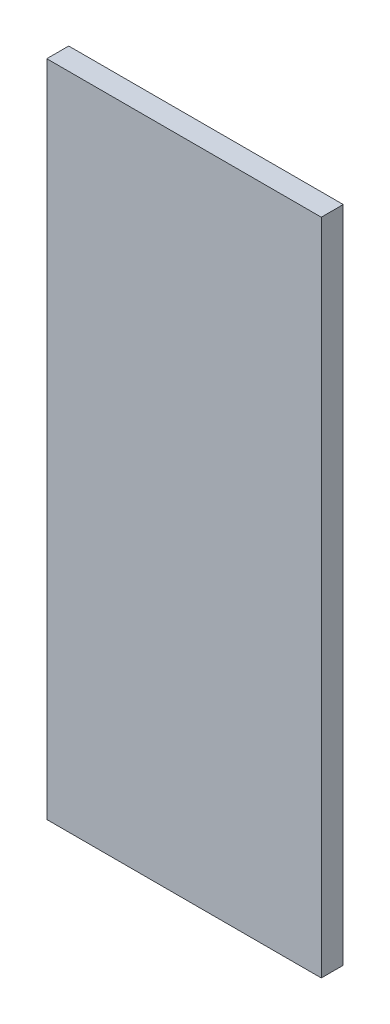
ISO-10303-21;
HEADER;
FILE_DESCRIPTION(('STEP AP214'),'2;1');
FILE_NAME('part.step','',(''),(''),'','','');
FILE_SCHEMA(('AUTOMOTIVE_DESIGN { 1 0 10303 214 1 1 1 1 }'));
ENDSEC;
DATA;
#1=APPLICATION_CONTEXT('core data for automotive mechanical design processes');
#2=APPLICATION_PROTOCOL_DEFINITION('international standard','automotive_design',2000,#1);
#3=PRODUCT_CONTEXT('',#1,'mechanical');
#4=PRODUCT('Part','Part','',(#3));
#5=PRODUCT_RELATED_PRODUCT_CATEGORY('part','',(#4));
#6=PRODUCT_DEFINITION_FORMATION('','',#4);
#7=PRODUCT_DEFINITION_CONTEXT('part definition',#1,'design');
#8=PRODUCT_DEFINITION('design','',#6,#7);
#9=PRODUCT_DEFINITION_SHAPE('','',#8);
#10=(LENGTH_UNIT() NAMED_UNIT(*) SI_UNIT(.MILLI.,.METRE.));
#11=(NAMED_UNIT(*) PLANE_ANGLE_UNIT() SI_UNIT($,.RADIAN.));
#12=(NAMED_UNIT(*) SI_UNIT($,.STERADIAN.) SOLID_ANGLE_UNIT());
#13=UNCERTAINTY_MEASURE_WITH_UNIT(LENGTH_MEASURE(1.E-05),#10,'distance_accuracy_value','');
#14=(GEOMETRIC_REPRESENTATION_CONTEXT(3) GLOBAL_UNCERTAINTY_ASSIGNED_CONTEXT((#13)) GLOBAL_UNIT_ASSIGNED_CONTEXT((#10,
#11,#12)) REPRESENTATION_CONTEXT('',''));
#15=CARTESIAN_POINT('',(0.,0.,0.));
#16=DIRECTION('',(0.,0.,1.));
#17=DIRECTION('',(1.,0.,0.));
#18=AXIS2_PLACEMENT_3D('',#15,#16,#17);
#19=CARTESIAN_POINT('',(-568.48934761149,-611.90552333629,-816.486147986318));
#20=DIRECTION('',(0.,0.,-1.));
#21=DIRECTION('',(-1.,0.,0.));
#22=AXIS2_PLACEMENT_3D('',#19,#20,#21);
#23=PLANE('',#22);
#24=DIRECTION('',(0.,1.,0.));
#25=VECTOR('',#24,1.);
#26=CARTESIAN_POINT('',(-628.489347611488,-611.90552333629,-816.486147986318));
#27=LINE('',#26,#25);
#28=CARTESIAN_POINT('',(-628.489347611488,-551.905523336291,-816.486147986318));
#29=VERTEX_POINT('',#28);
#30=CARTESIAN_POINT('',(-628.489347611488,-671.905523336291,-816.486147986318));
#31=VERTEX_POINT('',#30);
#32=EDGE_CURVE('E56',#29,#31,#27,.F.);
#33=ORIENTED_EDGE('',*,*,#32,.F.);
#34=DIRECTION('',(1.,0.,0.));
#35=VECTOR('',#34,1.);
#36=CARTESIAN_POINT('',(-568.48934761149,-551.905523336291,-816.486147986318));
#37=LINE('',#36,#35);
#38=CARTESIAN_POINT('',(-578.489347611488,-551.905523336291,-816.486147986318));
#39=VERTEX_POINT('',#38);
#40=EDGE_CURVE('E82',#39,#29,#37,.F.);
#41=ORIENTED_EDGE('',*,*,#40,.F.);
#42=DIRECTION('',(0.,1.,0.));
#43=VECTOR('',#42,1.);
#44=CARTESIAN_POINT('',(-578.489347611488,-611.90552333629,-816.486147986318));
#45=LINE('',#44,#43);
#46=CARTESIAN_POINT('',(-578.489347611488,-671.905523336291,-816.486147986318));
#47=VERTEX_POINT('',#46);
#48=EDGE_CURVE('E59',#47,#39,#45,.T.);
#49=ORIENTED_EDGE('',*,*,#48,.F.);
#50=DIRECTION('',(1.,0.,0.));
#51=VECTOR('',#50,1.);
#52=CARTESIAN_POINT('',(-568.48934761149,-671.905523336291,-816.486147986318));
#53=LINE('',#52,#51);
#54=EDGE_CURVE('E20',#31,#47,#53,.T.);
#55=ORIENTED_EDGE('',*,*,#54,.F.);
#56=EDGE_LOOP('',(#33,#41,#49,#55));
#57=FACE_BOUND('',#56,.T.);
#58=ADVANCED_FACE('F17',(#57),#23,.T.);
#59=CARTESIAN_POINT('',(-568.48934761149,-671.905523336291,-814.486147986318));
#60=DIRECTION('',(0.,-1.,0.));
#61=DIRECTION('',(0.,0.,-1.));
#62=AXIS2_PLACEMENT_3D('',#59,#60,#61);
#63=PLANE('',#62);
#64=DIRECTION('',(0.,0.,1.));
#65=VECTOR('',#64,1.);
#66=CARTESIAN_POINT('',(-628.489347611488,-671.905523336291,-814.486147986318));
#67=LINE('',#66,#65);
#68=CARTESIAN_POINT('',(-628.489347611488,-671.905523336291,-812.486147986318));
#69=VERTEX_POINT('',#68);
#70=EDGE_CURVE('E65',#31,#69,#67,.T.);
#71=ORIENTED_EDGE('',*,*,#70,.F.);
#72=ORIENTED_EDGE('',*,*,#54,.T.);
#73=DIRECTION('',(0.,0.,-1.));
#74=VECTOR('',#73,1.);
#75=CARTESIAN_POINT('',(-578.489347611488,-671.905523336291,-814.486147986318));
#76=LINE('',#75,#74);
#77=CARTESIAN_POINT('',(-578.489347611488,-671.905523336291,-812.486147986318));
#78=VERTEX_POINT('',#77);
#79=EDGE_CURVE('E87',#78,#47,#76,.T.);
#80=ORIENTED_EDGE('',*,*,#79,.F.);
#81=DIRECTION('',(-1.,0.,0.));
#82=VECTOR('',#81,1.);
#83=CARTESIAN_POINT('',(-568.48934761149,-671.905523336291,-812.486147986318));
#84=LINE('',#83,#82);
#85=EDGE_CURVE('E76',#78,#69,#84,.T.);
#86=ORIENTED_EDGE('',*,*,#85,.T.);
#87=EDGE_LOOP('',(#71,#72,#80,#86));
#88=FACE_BOUND('',#87,.T.);
#89=ADVANCED_FACE('F75',(#88),#63,.T.);
#90=CARTESIAN_POINT('',(-628.489347611488,-611.90552333629,-814.486147986318));
#91=DIRECTION('',(-1.,0.,0.));
#92=DIRECTION('',(0.,0.,1.));
#93=AXIS2_PLACEMENT_3D('',#90,#91,#92);
#94=PLANE('',#93);
#95=DIRECTION('',(0.,0.,1.));
#96=VECTOR('',#95,1.);
#97=CARTESIAN_POINT('',(-628.489347611488,-551.905523336291,-814.486147986318));
#98=LINE('',#97,#96);
#99=CARTESIAN_POINT('',(-628.489347611488,-551.905523336291,-812.486147986318));
#100=VERTEX_POINT('',#99);
#101=EDGE_CURVE('E71',#29,#100,#98,.T.);
#102=ORIENTED_EDGE('',*,*,#101,.F.);
#103=ORIENTED_EDGE('',*,*,#32,.T.);
#104=ORIENTED_EDGE('',*,*,#70,.T.);
#105=DIRECTION('',(0.,1.,0.));
#106=VECTOR('',#105,1.);
#107=CARTESIAN_POINT('',(-628.489347611488,-611.90552333629,-812.486147986318));
#108=LINE('',#107,#106);
#109=EDGE_CURVE('E94',#69,#100,#108,.T.);
#110=ORIENTED_EDGE('',*,*,#109,.T.);
#111=EDGE_LOOP('',(#102,#103,#104,#110));
#112=FACE_BOUND('',#111,.T.);
#113=ADVANCED_FACE('F68',(#112),#94,.T.);
#114=CARTESIAN_POINT('',(-568.48934761149,-551.905523336291,-814.486147986318));
#115=DIRECTION('',(0.,1.,0.));
#116=DIRECTION('',(0.,0.,1.));
#117=AXIS2_PLACEMENT_3D('',#114,#115,#116);
#118=PLANE('',#117);
#119=DIRECTION('',(0.,0.,-1.));
#120=VECTOR('',#119,1.);
#121=CARTESIAN_POINT('',(-578.489347611488,-551.905523336291,-814.486147986318));
#122=LINE('',#121,#120);
#123=CARTESIAN_POINT('',(-578.489347611488,-551.905523336291,-812.486147986318));
#124=VERTEX_POINT('',#123);
#125=EDGE_CURVE('E35',#39,#124,#122,.F.);
#126=ORIENTED_EDGE('',*,*,#125,.F.);
#127=ORIENTED_EDGE('',*,*,#40,.T.);
#128=ORIENTED_EDGE('',*,*,#101,.T.);
#129=DIRECTION('',(-1.,0.,0.));
#130=VECTOR('',#129,1.);
#131=CARTESIAN_POINT('',(-568.48934761149,-551.905523336291,-812.486147986318));
#132=LINE('',#131,#130);
#133=EDGE_CURVE('E27',#100,#124,#132,.F.);
#134=ORIENTED_EDGE('',*,*,#133,.T.);
#135=EDGE_LOOP('',(#126,#127,#128,#134));
#136=FACE_BOUND('',#135,.T.);
#137=ADVANCED_FACE('F101',(#136),#118,.T.);
#138=CARTESIAN_POINT('',(-578.489347611488,-611.90552333629,-814.486147986318));
#139=DIRECTION('',(1.,0.,0.));
#140=DIRECTION('',(0.,0.,-1.));
#141=AXIS2_PLACEMENT_3D('',#138,#139,#140);
#142=PLANE('',#141);
#143=ORIENTED_EDGE('',*,*,#79,.T.);
#144=ORIENTED_EDGE('',*,*,#48,.T.);
#145=ORIENTED_EDGE('',*,*,#125,.T.);
#146=DIRECTION('',(0.,1.,0.));
#147=VECTOR('',#146,1.);
#148=CARTESIAN_POINT('',(-578.489347611488,-611.90552333629,-812.486147986318));
#149=LINE('',#148,#147);
#150=EDGE_CURVE('E11',#124,#78,#149,.F.);
#151=ORIENTED_EDGE('',*,*,#150,.T.);
#152=EDGE_LOOP('',(#143,#144,#145,#151));
#153=FACE_BOUND('',#152,.T.);
#154=ADVANCED_FACE('F104',(#153),#142,.T.);
#155=CARTESIAN_POINT('',(-568.48934761149,-611.90552333629,-812.486147986318));
#156=DIRECTION('',(0.,0.,-1.));
#157=DIRECTION('',(-1.,0.,0.));
#158=AXIS2_PLACEMENT_3D('',#155,#156,#157);
#159=PLANE('',#158);
#160=ORIENTED_EDGE('',*,*,#133,.F.);
#161=ORIENTED_EDGE('',*,*,#109,.F.);
#162=ORIENTED_EDGE('',*,*,#85,.F.);
#163=ORIENTED_EDGE('',*,*,#150,.F.);
#164=EDGE_LOOP('',(#160,#161,#162,#163));
#165=FACE_BOUND('',#164,.T.);
#166=ADVANCED_FACE('F103',(#165),#159,.F.);
#167=CLOSED_SHELL('',(#58,#89,#113,#137,#154,#166));
#168=MANIFOLD_SOLID_BREP('B1',#167);
#169=ADVANCED_BREP_SHAPE_REPRESENTATION('',(#18,#168),#14);
#170=SHAPE_DEFINITION_REPRESENTATION(#9,#169);
ENDSEC;
END-ISO-10303-21;
